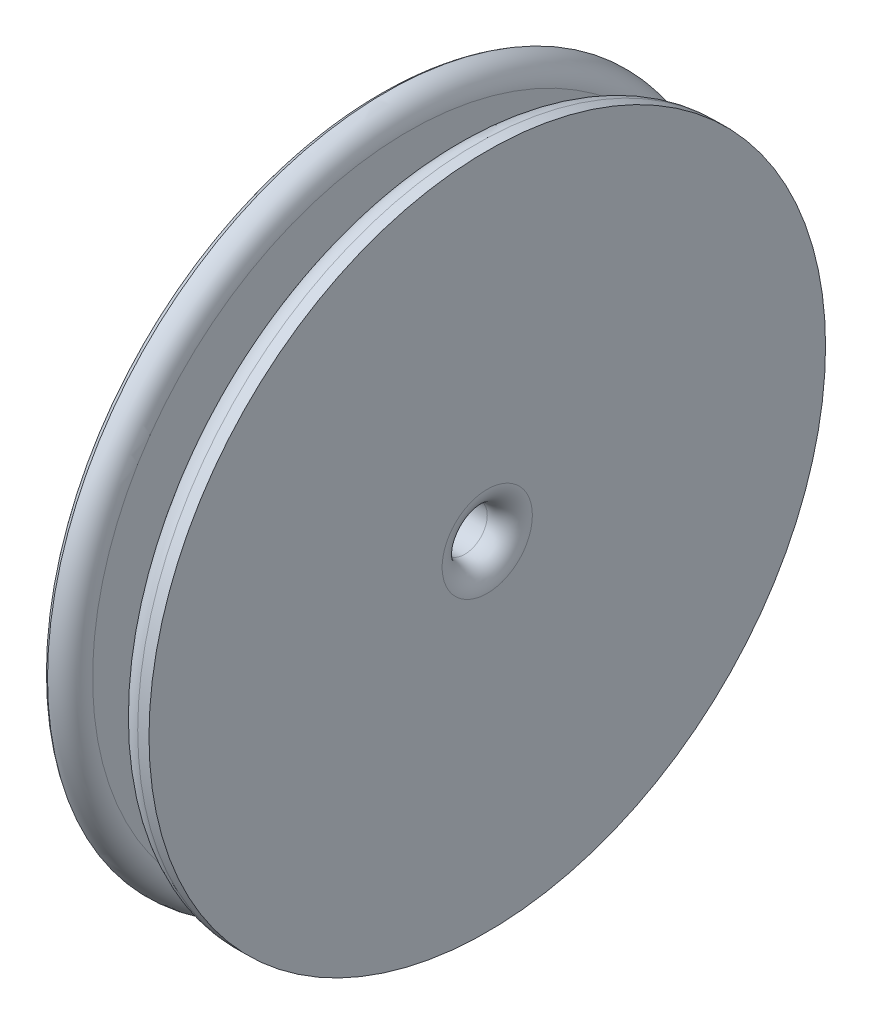
ISO-10303-21;
HEADER;
FILE_DESCRIPTION(('STEP AP214'),'2;1');
FILE_NAME('part.step','',(''),(''),'','','');
FILE_SCHEMA(('AUTOMOTIVE_DESIGN { 1 0 10303 214 1 1 1 1 }'));
ENDSEC;
DATA;
#1=APPLICATION_CONTEXT('core data for automotive mechanical design processes');
#2=APPLICATION_PROTOCOL_DEFINITION('international standard','automotive_design',2000,#1);
#3=PRODUCT_CONTEXT('',#1,'mechanical');
#4=PRODUCT('Part','Part','',(#3));
#5=PRODUCT_RELATED_PRODUCT_CATEGORY('part','',(#4));
#6=PRODUCT_DEFINITION_FORMATION('','',#4);
#7=PRODUCT_DEFINITION_CONTEXT('part definition',#1,'design');
#8=PRODUCT_DEFINITION('design','',#6,#7);
#9=PRODUCT_DEFINITION_SHAPE('','',#8);
#10=(LENGTH_UNIT() NAMED_UNIT(*) SI_UNIT(.MILLI.,.METRE.));
#11=(NAMED_UNIT(*) PLANE_ANGLE_UNIT() SI_UNIT($,.RADIAN.));
#12=(NAMED_UNIT(*) SI_UNIT($,.STERADIAN.) SOLID_ANGLE_UNIT());
#13=UNCERTAINTY_MEASURE_WITH_UNIT(LENGTH_MEASURE(1.E-05),#10,'distance_accuracy_value','');
#14=(GEOMETRIC_REPRESENTATION_CONTEXT(3) GLOBAL_UNCERTAINTY_ASSIGNED_CONTEXT((#13)) GLOBAL_UNIT_ASSIGNED_CONTEXT((#10,
#11,#12)) REPRESENTATION_CONTEXT('',''));
#15=CARTESIAN_POINT('',(0.,0.,0.));
#16=DIRECTION('',(0.,0.,1.));
#17=DIRECTION('',(1.,0.,0.));
#18=AXIS2_PLACEMENT_3D('',#15,#16,#17);
#19=CARTESIAN_POINT('',(0.,0.,0.));
#20=DIRECTION('',(-1.,0.,0.));
#21=DIRECTION('',(0.,0.,1.));
#22=AXIS2_PLACEMENT_3D('',#19,#20,#21);
#23=PLANE('',#22);
#24=CARTESIAN_POINT('',(0.,0.,5.31428571428572));
#25=DIRECTION('',(-1.,0.,0.));
#26=DIRECTION('',(0.,0.,1.));
#27=AXIS2_PLACEMENT_3D('',#24,#25,#26);
#28=CIRCLE('',#27,28.2679491924311);
#29=CARTESIAN_POINT('',(0.,0.,33.5822349067168));
#30=VERTEX_POINT('',#29);
#31=EDGE_CURVE('E40',#30,#30,#28,.T.);
#32=ORIENTED_EDGE('',*,*,#31,.T.);
#33=EDGE_LOOP('',(#32));
#34=FACE_BOUND('',#33,.T.);
#35=CARTESIAN_POINT('',(0.,0.,5.31428571428572));
#36=DIRECTION('',(-1.,0.,0.));
#37=DIRECTION('',(0.,0.,1.));
#38=AXIS2_PLACEMENT_3D('',#35,#36,#37);
#39=CIRCLE('',#38,4.);
#40=CARTESIAN_POINT('',(0.,0.,9.31428571428572));
#41=VERTEX_POINT('',#40);
#42=EDGE_CURVE('E44',#41,#41,#39,.F.);
#43=ORIENTED_EDGE('',*,*,#42,.T.);
#44=EDGE_LOOP('',(#43));
#45=FACE_BOUND('',#44,.T.);
#46=ADVANCED_FACE('F33',(#34,#45),#23,.T.);
#47=CARTESIAN_POINT('',(3.,0.,-24.6857142857143));
#48=DIRECTION('',(1.,0.,0.));
#49=DIRECTION('',(0.,0.,-1.));
#50=AXIS2_PLACEMENT_3D('',#47,#48,#49);
#51=PLANE('',#50);
#52=CARTESIAN_POINT('',(3.,0.,5.31428571428572));
#53=DIRECTION('',(1.,0.,0.));
#54=DIRECTION('',(0.,0.,-1.));
#55=AXIS2_PLACEMENT_3D('',#52,#53,#54);
#56=CIRCLE('',#55,28.);
#57=CARTESIAN_POINT('',(3.,0.,-22.6857142857143));
#58=VERTEX_POINT('',#57);
#59=EDGE_CURVE('E72',#58,#58,#56,.T.);
#60=ORIENTED_EDGE('',*,*,#59,.T.);
#61=EDGE_LOOP('',(#60));
#62=FACE_BOUND('',#61,.T.);
#63=CARTESIAN_POINT('',(3.,0.,5.31428571428572));
#64=DIRECTION('',(1.,0.,0.));
#65=DIRECTION('',(0.,0.,-1.));
#66=AXIS2_PLACEMENT_3D('',#63,#64,#65);
#67=CIRCLE('',#66,7.31428571428572);
#68=CARTESIAN_POINT('',(3.,0.,-2.));
#69=VERTEX_POINT('',#68);
#70=EDGE_CURVE('E75',#69,#69,#67,.F.);
#71=ORIENTED_EDGE('',*,*,#70,.T.);
#72=EDGE_LOOP('',(#71));
#73=FACE_BOUND('',#72,.T.);
#74=ADVANCED_FACE('F95',(#62,#73),#51,.T.);
#75=CARTESIAN_POINT('',(7.,0.,0.));
#76=DIRECTION('',(-1.,0.,0.));
#77=DIRECTION('',(0.,0.,1.));
#78=AXIS2_PLACEMENT_3D('',#75,#76,#77);
#79=PLANE('',#78);
#80=CARTESIAN_POINT('',(7.,0.,5.31428571428572));
#81=DIRECTION('',(-1.,0.,0.));
#82=DIRECTION('',(0.,0.,1.));
#83=AXIS2_PLACEMENT_3D('',#80,#81,#82);
#84=CIRCLE('',#83,28.);
#85=CARTESIAN_POINT('',(7.00000000000001,0.,33.3142857142857));
#86=VERTEX_POINT('',#85);
#87=EDGE_CURVE('E56',#86,#86,#84,.T.);
#88=ORIENTED_EDGE('',*,*,#87,.T.);
#89=EDGE_LOOP('',(#88));
#90=FACE_BOUND('',#89,.T.);
#91=CARTESIAN_POINT('',(7.,0.,5.31428571428572));
#92=DIRECTION('',(-1.,0.,0.));
#93=DIRECTION('',(0.,0.,1.));
#94=AXIS2_PLACEMENT_3D('',#91,#92,#93);
#95=CIRCLE('',#94,7.31428571428572);
#96=CARTESIAN_POINT('',(7.,0.,12.6285714285714));
#97=VERTEX_POINT('',#96);
#98=EDGE_CURVE('E62',#97,#97,#95,.F.);
#99=ORIENTED_EDGE('',*,*,#98,.T.);
#100=EDGE_LOOP('',(#99));
#101=FACE_BOUND('',#100,.T.);
#102=ADVANCED_FACE('F85',(#90,#101),#79,.T.);
#103=CARTESIAN_POINT('',(10.,0.,5.31428571428572));
#104=DIRECTION('',(1.,0.,0.));
#105=DIRECTION('',(0.,0.,-1.));
#106=AXIS2_PLACEMENT_3D('',#103,#104,#105);
#107=CYLINDRICAL_SURFACE('',#106,30.);
#108=CARTESIAN_POINT('',(9.00000000000001,0.,5.31428571428572));
#109=DIRECTION('',(-1.,0.,0.));
#110=DIRECTION('',(0.,0.,1.));
#111=AXIS2_PLACEMENT_3D('',#108,#109,#110);
#112=CIRCLE('',#111,30.);
#113=CARTESIAN_POINT('',(9.00000000000001,0.,35.3142857142857));
#114=VERTEX_POINT('',#113);
#115=EDGE_CURVE('E59',#114,#114,#112,.F.);
#116=ORIENTED_EDGE('',*,*,#115,.T.);
#117=EDGE_LOOP('',(#116));
#118=FACE_BOUND('',#117,.T.);
#119=CARTESIAN_POINT('',(10.,0.,5.31428571428572));
#120=DIRECTION('',(1.,0.,0.));
#121=DIRECTION('',(0.,0.,-1.));
#122=AXIS2_PLACEMENT_3D('',#119,#120,#121);
#123=CIRCLE('',#122,30.);
#124=CARTESIAN_POINT('',(10.,0.,-24.6857142857143));
#125=VERTEX_POINT('',#124);
#126=EDGE_CURVE('E66',#125,#125,#123,.T.);
#127=ORIENTED_EDGE('',*,*,#126,.F.);
#128=EDGE_LOOP('',(#127));
#129=FACE_BOUND('',#128,.T.);
#130=ADVANCED_FACE('F83',(#118,#129),#107,.T.);
#131=CARTESIAN_POINT('',(10.,0.,-24.6857142857143));
#132=DIRECTION('',(1.,0.,0.));
#133=DIRECTION('',(0.,0.,-1.));
#134=AXIS2_PLACEMENT_3D('',#131,#132,#133);
#135=PLANE('',#134);
#136=CARTESIAN_POINT('',(10.,0.,5.31428571428572));
#137=DIRECTION('',(1.,0.,0.));
#138=DIRECTION('',(0.,0.,-1.));
#139=AXIS2_PLACEMENT_3D('',#136,#137,#138);
#140=CIRCLE('',#139,4.);
#141=CARTESIAN_POINT('',(10.,0.,1.31428571428572));
#142=VERTEX_POINT('',#141);
#143=EDGE_CURVE('E48',#142,#142,#140,.F.);
#144=ORIENTED_EDGE('',*,*,#143,.T.);
#145=EDGE_LOOP('',(#144));
#146=FACE_BOUND('',#145,.T.);
#147=ORIENTED_EDGE('',*,*,#126,.T.);
#148=EDGE_LOOP('',(#147));
#149=FACE_BOUND('',#148,.T.);
#150=ADVANCED_FACE('F81',(#146,#149),#135,.T.);
#151=CARTESIAN_POINT('',(0.,0.,5.31428571428572));
#152=DIRECTION('',(1.,0.,0.));
#153=DIRECTION('',(0.,0.,-1.));
#154=AXIS2_PLACEMENT_3D('',#151,#152,#153);
#155=CYLINDRICAL_SURFACE('',#154,2.);
#156=CARTESIAN_POINT('',(2.,0.,5.31428571428572));
#157=DIRECTION('',(-1.,0.,0.));
#158=DIRECTION('',(0.,0.,1.));
#159=AXIS2_PLACEMENT_3D('',#156,#157,#158);
#160=CIRCLE('',#159,2.);
#161=CARTESIAN_POINT('',(2.,0.,7.31428571428572));
#162=VERTEX_POINT('',#161);
#163=EDGE_CURVE('E10',#162,#162,#160,.T.);
#164=ORIENTED_EDGE('',*,*,#163,.T.);
#165=EDGE_LOOP('',(#164));
#166=FACE_BOUND('',#165,.T.);
#167=CARTESIAN_POINT('',(8.,0.,5.31428571428572));
#168=DIRECTION('',(1.,0.,0.));
#169=DIRECTION('',(0.,0.,-1.));
#170=AXIS2_PLACEMENT_3D('',#167,#168,#169);
#171=CIRCLE('',#170,2.);
#172=CARTESIAN_POINT('',(8.,0.,3.31428571428572));
#173=VERTEX_POINT('',#172);
#174=EDGE_CURVE('E53',#173,#173,#171,.T.);
#175=ORIENTED_EDGE('',*,*,#174,.T.);
#176=EDGE_LOOP('',(#175));
#177=FACE_BOUND('',#176,.T.);
#178=ADVANCED_FACE('F92',(#166,#177),#155,.F.);
#179=CARTESIAN_POINT('',(1.,0.,5.31428571428572));
#180=DIRECTION('',(1.,0.,0.));
#181=DIRECTION('',(0.,0.,-1.));
#182=AXIS2_PLACEMENT_3D('',#179,#180,#181);
#183=TOROIDAL_SURFACE('',#182,28.,2.);
#184=CARTESIAN_POINT('',(1.,0.,5.31428571428572));
#185=DIRECTION('',(1.,0.,0.));
#186=DIRECTION('',(0.,0.,-1.));
#187=AXIS2_PLACEMENT_3D('',#184,#185,#186);
#188=CIRCLE('',#187,30.);
#189=CARTESIAN_POINT('',(1.,0.,-24.6857142857143));
#190=VERTEX_POINT('',#189);
#191=EDGE_CURVE('E69',#190,#190,#188,.F.);
#192=ORIENTED_EDGE('',*,*,#191,.F.);
#193=EDGE_LOOP('',(#192));
#194=FACE_BOUND('',#193,.T.);
#195=ORIENTED_EDGE('',*,*,#59,.F.);
#196=EDGE_LOOP('',(#195));
#197=FACE_BOUND('',#196,.T.);
#198=ADVANCED_FACE('F107',(#194,#197),#183,.T.);
#199=CARTESIAN_POINT('',(5.,0.,5.31428571428572));
#200=DIRECTION('',(1.,0.,0.));
#201=DIRECTION('',(0.,0.,-1.));
#202=AXIS2_PLACEMENT_3D('',#199,#200,#201);
#203=TOROIDAL_SURFACE('',#202,7.31428571428572,2.);
#204=ORIENTED_EDGE('',*,*,#70,.F.);
#205=EDGE_LOOP('',(#204));
#206=FACE_BOUND('',#205,.T.);
#207=CARTESIAN_POINT('',(5.,0.,5.31428571428572));
#208=DIRECTION('',(1.,0.,0.));
#209=DIRECTION('',(0.,0.,-1.));
#210=AXIS2_PLACEMENT_3D('',#207,#208,#209);
#211=CIRCLE('',#210,5.31428571428572);
#212=CARTESIAN_POINT('',(5.,0.,0.));
#213=VERTEX_POINT('',#212);
#214=EDGE_CURVE('E63',#213,#213,#211,.T.);
#215=ORIENTED_EDGE('',*,*,#214,.F.);
#216=EDGE_LOOP('',(#215));
#217=FACE_BOUND('',#216,.T.);
#218=ADVANCED_FACE('F110',(#206,#217),#203,.F.);
#219=CARTESIAN_POINT('',(5.,0.,5.31428571428572));
#220=DIRECTION('',(-1.,0.,0.));
#221=DIRECTION('',(0.,0.,1.));
#222=AXIS2_PLACEMENT_3D('',#219,#220,#221);
#223=TOROIDAL_SURFACE('',#222,7.31428571428572,2.);
#224=ORIENTED_EDGE('',*,*,#214,.T.);
#225=EDGE_LOOP('',(#224));
#226=FACE_BOUND('',#225,.T.);
#227=ORIENTED_EDGE('',*,*,#98,.F.);
#228=EDGE_LOOP('',(#227));
#229=FACE_BOUND('',#228,.T.);
#230=ADVANCED_FACE('F112',(#226,#229),#223,.F.);
#231=CARTESIAN_POINT('',(9.,0.,5.31428571428572));
#232=DIRECTION('',(-1.,0.,0.));
#233=DIRECTION('',(0.,0.,1.));
#234=AXIS2_PLACEMENT_3D('',#231,#232,#233);
#235=TOROIDAL_SURFACE('',#234,28.,2.);
#236=ORIENTED_EDGE('',*,*,#87,.F.);
#237=EDGE_LOOP('',(#236));
#238=FACE_BOUND('',#237,.T.);
#239=ORIENTED_EDGE('',*,*,#115,.F.);
#240=EDGE_LOOP('',(#239));
#241=FACE_BOUND('',#240,.T.);
#242=ADVANCED_FACE('F115',(#238,#241),#235,.T.);
#243=CARTESIAN_POINT('',(8.,0.,5.31428571428572));
#244=DIRECTION('',(1.,0.,0.));
#245=DIRECTION('',(0.,0.,-1.));
#246=AXIS2_PLACEMENT_3D('',#243,#244,#245);
#247=TOROIDAL_SURFACE('',#246,4.,2.);
#248=ORIENTED_EDGE('',*,*,#143,.F.);
#249=EDGE_LOOP('',(#248));
#250=FACE_BOUND('',#249,.T.);
#251=ORIENTED_EDGE('',*,*,#174,.F.);
#252=EDGE_LOOP('',(#251));
#253=FACE_BOUND('',#252,.T.);
#254=ADVANCED_FACE('F122',(#250,#253),#247,.T.);
#255=CARTESIAN_POINT('',(2.,0.,5.31428571428572));
#256=DIRECTION('',(1.,0.,0.));
#257=DIRECTION('',(0.,0.,-1.));
#258=AXIS2_PLACEMENT_3D('',#255,#256,#257);
#259=TOROIDAL_SURFACE('',#258,28.2679491924311,2.);
#260=ORIENTED_EDGE('',*,*,#31,.F.);
#261=EDGE_LOOP('',(#260));
#262=FACE_BOUND('',#261,.T.);
#263=ORIENTED_EDGE('',*,*,#191,.T.);
#264=EDGE_LOOP('',(#263));
#265=FACE_BOUND('',#264,.T.);
#266=ADVANCED_FACE('F125',(#262,#265),#259,.T.);
#267=CARTESIAN_POINT('',(2.,0.,5.31428571428572));
#268=DIRECTION('',(-1.,0.,0.));
#269=DIRECTION('',(0.,0.,1.));
#270=AXIS2_PLACEMENT_3D('',#267,#268,#269);
#271=TOROIDAL_SURFACE('',#270,4.,2.);
#272=ORIENTED_EDGE('',*,*,#163,.F.);
#273=EDGE_LOOP('',(#272));
#274=FACE_BOUND('',#273,.T.);
#275=ORIENTED_EDGE('',*,*,#42,.F.);
#276=EDGE_LOOP('',(#275));
#277=FACE_BOUND('',#276,.T.);
#278=ADVANCED_FACE('F35',(#274,#277),#271,.T.);
#279=CLOSED_SHELL('',(#46,#74,#102,#130,#150,#178,#198,#218,#230,#242,#254,#266,#278));
#280=MANIFOLD_SOLID_BREP('B2',#279);
#281=ADVANCED_BREP_SHAPE_REPRESENTATION('',(#18,#280),#14);
#282=SHAPE_DEFINITION_REPRESENTATION(#9,#281);
ENDSEC;
END-ISO-10303-21;
